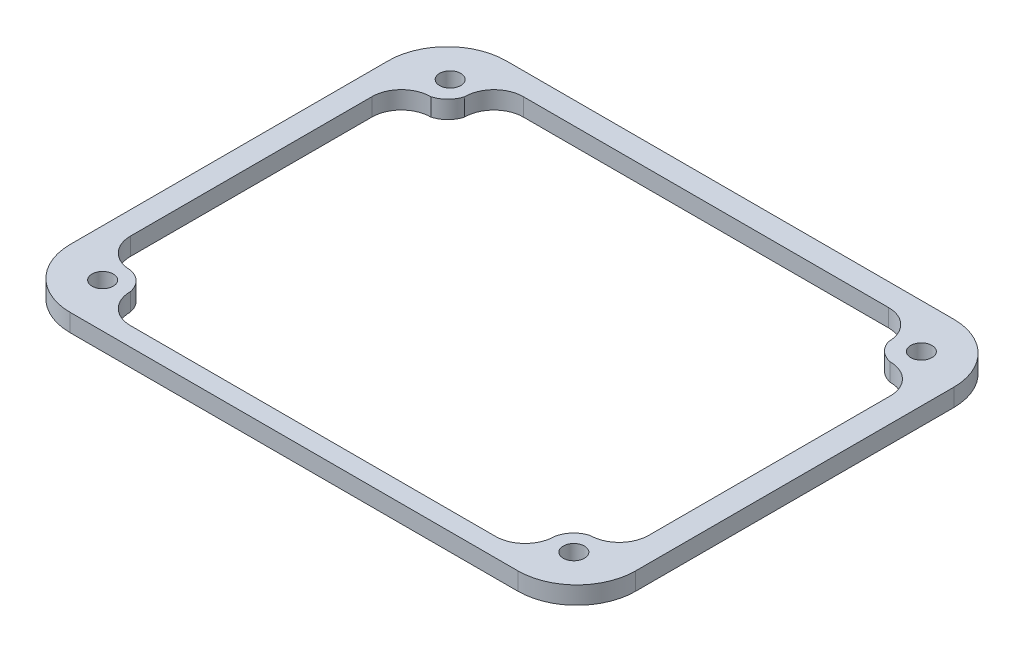
ISO-10303-21;
HEADER;
FILE_DESCRIPTION(('STEP AP214'),'2;1');
FILE_NAME('part.step','',(''),(''),'','','');
FILE_SCHEMA(('AUTOMOTIVE_DESIGN { 1 0 10303 214 1 1 1 1 }'));
ENDSEC;
DATA;
#1=APPLICATION_CONTEXT('core data for automotive mechanical design processes');
#2=APPLICATION_PROTOCOL_DEFINITION('international standard','automotive_design',2000,#1);
#3=PRODUCT_CONTEXT('',#1,'mechanical');
#4=PRODUCT('Part','Part','',(#3));
#5=PRODUCT_RELATED_PRODUCT_CATEGORY('part','',(#4));
#6=PRODUCT_DEFINITION_FORMATION('','',#4);
#7=PRODUCT_DEFINITION_CONTEXT('part definition',#1,'design');
#8=PRODUCT_DEFINITION('design','',#6,#7);
#9=PRODUCT_DEFINITION_SHAPE('','',#8);
#10=(LENGTH_UNIT() NAMED_UNIT(*) SI_UNIT(.MILLI.,.METRE.));
#11=(NAMED_UNIT(*) PLANE_ANGLE_UNIT() SI_UNIT($,.RADIAN.));
#12=(NAMED_UNIT(*) SI_UNIT($,.STERADIAN.) SOLID_ANGLE_UNIT());
#13=UNCERTAINTY_MEASURE_WITH_UNIT(LENGTH_MEASURE(1.E-05),#10,'distance_accuracy_value','');
#14=(GEOMETRIC_REPRESENTATION_CONTEXT(3) GLOBAL_UNCERTAINTY_ASSIGNED_CONTEXT((#13)) GLOBAL_UNIT_ASSIGNED_CONTEXT((#10,
#11,#12)) REPRESENTATION_CONTEXT('',''));
#15=CARTESIAN_POINT('',(0.,0.,0.));
#16=DIRECTION('',(0.,0.,1.));
#17=DIRECTION('',(1.,0.,0.));
#18=AXIS2_PLACEMENT_3D('',#15,#16,#17);
#19=CARTESIAN_POINT('',(-37.8874053561113,3.,26.830201081189));
#20=DIRECTION('',(0.,-1.,0.));
#21=DIRECTION('',(0.,0.,-1.));
#22=AXIS2_PLACEMENT_3D('',#19,#20,#21);
#23=PLANE('',#22);
#24=CARTESIAN_POINT('',(40.1125946438893,3.,29.330201081189));
#25=DIRECTION('',(0.,1.,0.));
#26=DIRECTION('',(0.,0.,1.));
#27=AXIS2_PLACEMENT_3D('',#24,#25,#26);
#28=CIRCLE('',#27,1.8);
#29=CARTESIAN_POINT('',(40.1125946438893,3.,31.130201081189));
#30=VERTEX_POINT('',#29);
#31=EDGE_CURVE('E370',#30,#30,#28,.T.);
#32=ORIENTED_EDGE('',*,*,#31,.F.);
#33=EDGE_LOOP('',(#32));
#34=FACE_BOUND('',#33,.T.);
#35=CARTESIAN_POINT('',(-39.8874053561107,3.,29.330201081189));
#36=DIRECTION('',(0.,1.,0.));
#37=DIRECTION('',(0.,0.,1.));
#38=AXIS2_PLACEMENT_3D('',#35,#36,#37);
#39=CIRCLE('',#38,1.8);
#40=CARTESIAN_POINT('',(-39.8874053561107,3.,31.130201081189));
#41=VERTEX_POINT('',#40);
#42=EDGE_CURVE('E378',#41,#41,#39,.T.);
#43=ORIENTED_EDGE('',*,*,#42,.F.);
#44=EDGE_LOOP('',(#43));
#45=FACE_BOUND('',#44,.T.);
#46=CARTESIAN_POINT('',(40.1125946438887,3.,-29.669798918811));
#47=DIRECTION('',(0.,1.,0.));
#48=DIRECTION('',(0.,0.,1.));
#49=AXIS2_PLACEMENT_3D('',#46,#47,#48);
#50=CIRCLE('',#49,1.8);
#51=CARTESIAN_POINT('',(40.1125946438887,3.,-27.869798918811));
#52=VERTEX_POINT('',#51);
#53=EDGE_CURVE('E386',#52,#52,#50,.T.);
#54=ORIENTED_EDGE('',*,*,#53,.F.);
#55=EDGE_LOOP('',(#54));
#56=FACE_BOUND('',#55,.T.);
#57=CARTESIAN_POINT('',(-39.8874053561113,3.,-29.669798918811));
#58=DIRECTION('',(0.,1.,0.));
#59=DIRECTION('',(0.,0.,1.));
#60=AXIS2_PLACEMENT_3D('',#57,#58,#59);
#61=CIRCLE('',#60,1.8);
#62=CARTESIAN_POINT('',(-39.8874053561113,3.,-27.869798918811));
#63=VERTEX_POINT('',#62);
#64=EDGE_CURVE('E394',#63,#63,#61,.T.);
#65=ORIENTED_EDGE('',*,*,#64,.F.);
#66=EDGE_LOOP('',(#65));
#67=FACE_BOUND('',#66,.T.);
#68=CARTESIAN_POINT('',(-37.8874053561113,3.,26.830201081189));
#69=DIRECTION('',(0.,1.,0.));
#70=DIRECTION('',(0.,0.,-1.));
#71=AXIS2_PLACEMENT_3D('',#68,#69,#70);
#72=CIRCLE('',#71,10.);
#73=CARTESIAN_POINT('',(-47.8874053561113,3.,26.830201081189));
#74=VERTEX_POINT('',#73);
#75=CARTESIAN_POINT('',(-37.8874053561112,3.,36.830201081189));
#76=VERTEX_POINT('',#75);
#77=EDGE_CURVE('E402',#74,#76,#72,.T.);
#78=ORIENTED_EDGE('',*,*,#77,.T.);
#79=DIRECTION('',(1.,0.,0.));
#80=VECTOR('',#79,1.);
#81=CARTESIAN_POINT('',(-37.8874053561112,3.,36.830201081189));
#82=LINE('',#81,#80);
#83=CARTESIAN_POINT('',(38.1125946438886,3.,36.830201081189));
#84=VERTEX_POINT('',#83);
#85=EDGE_CURVE('E406',#76,#84,#82,.T.);
#86=ORIENTED_EDGE('',*,*,#85,.T.);
#87=CARTESIAN_POINT('',(38.1125946438887,3.,26.830201081189));
#88=DIRECTION('',(0.,1.,0.));
#89=DIRECTION('',(0.,0.,1.));
#90=AXIS2_PLACEMENT_3D('',#87,#88,#89);
#91=CIRCLE('',#90,10.);
#92=CARTESIAN_POINT('',(48.1125946438887,3.,26.830201081189));
#93=VERTEX_POINT('',#92);
#94=EDGE_CURVE('E410',#84,#93,#91,.T.);
#95=ORIENTED_EDGE('',*,*,#94,.T.);
#96=DIRECTION('',(0.,0.,-1.));
#97=VECTOR('',#96,1.);
#98=CARTESIAN_POINT('',(48.1125946438887,3.,-27.1697989188109));
#99=LINE('',#98,#97);
#100=CARTESIAN_POINT('',(48.1125946438887,3.,-27.1697989188109));
#101=VERTEX_POINT('',#100);
#102=EDGE_CURVE('E413',#93,#101,#99,.T.);
#103=ORIENTED_EDGE('',*,*,#102,.T.);
#104=CARTESIAN_POINT('',(38.1125946438887,3.,-27.169798918811));
#105=DIRECTION('',(0.,1.,0.));
#106=DIRECTION('',(0.,0.,1.));
#107=AXIS2_PLACEMENT_3D('',#104,#105,#106);
#108=CIRCLE('',#107,10.);
#109=CARTESIAN_POINT('',(38.1125946438886,3.,-37.1697989188109));
#110=VERTEX_POINT('',#109);
#111=EDGE_CURVE('E416',#101,#110,#108,.T.);
#112=ORIENTED_EDGE('',*,*,#111,.T.);
#113=DIRECTION('',(-1.,0.,0.));
#114=VECTOR('',#113,1.);
#115=CARTESIAN_POINT('',(-37.8874053561112,3.,-37.1697989188109));
#116=LINE('',#115,#114);
#117=CARTESIAN_POINT('',(-37.8874053561112,3.,-37.1697989188109));
#118=VERTEX_POINT('',#117);
#119=EDGE_CURVE('E419',#110,#118,#116,.T.);
#120=ORIENTED_EDGE('',*,*,#119,.T.);
#121=CARTESIAN_POINT('',(-37.8874053561113,3.,-27.169798918811));
#122=DIRECTION('',(0.,1.,0.));
#123=DIRECTION('',(0.,0.,-1.));
#124=AXIS2_PLACEMENT_3D('',#121,#122,#123);
#125=CIRCLE('',#124,10.);
#126=CARTESIAN_POINT('',(-47.8874053561113,3.,-27.1697989188109));
#127=VERTEX_POINT('',#126);
#128=EDGE_CURVE('E422',#118,#127,#125,.T.);
#129=ORIENTED_EDGE('',*,*,#128,.T.);
#130=DIRECTION('',(0.,0.,1.));
#131=VECTOR('',#130,1.);
#132=CARTESIAN_POINT('',(-47.8874053561113,3.,-27.1697989188109));
#133=LINE('',#132,#131);
#134=EDGE_CURVE('E425',#127,#74,#133,.T.);
#135=ORIENTED_EDGE('',*,*,#134,.T.);
#136=EDGE_LOOP('',(#78,#86,#95,#103,#112,#120,#129,#135));
#137=FACE_BOUND('',#136,.T.);
#138=CARTESIAN_POINT('',(39.,3.,-20.5));
#139=DIRECTION('',(0.,1.,0.));
#140=DIRECTION('',(0.,0.,1.));
#141=AXIS2_PLACEMENT_3D('',#138,#139,#140);
#142=CIRCLE('',#141,5.);
#143=CARTESIAN_POINT('',(44.,3.,-20.5));
#144=VERTEX_POINT('',#143);
#145=CARTESIAN_POINT('',(39.,3.,-25.5));
#146=VERTEX_POINT('',#145);
#147=EDGE_CURVE('E201',#144,#146,#142,.T.);
#148=ORIENTED_EDGE('',*,*,#147,.F.);
#149=DIRECTION('',(0.,0.,-1.));
#150=VECTOR('',#149,1.);
#151=CARTESIAN_POINT('',(44.,3.,-20.5));
#152=LINE('',#151,#150);
#153=CARTESIAN_POINT('',(44.,3.,20.5));
#154=VERTEX_POINT('',#153);
#155=EDGE_CURVE('E266',#154,#144,#152,.T.);
#156=ORIENTED_EDGE('',*,*,#155,.F.);
#157=CARTESIAN_POINT('',(39.,3.,20.5));
#158=DIRECTION('',(0.,1.,0.));
#159=DIRECTION('',(0.,0.,-1.));
#160=AXIS2_PLACEMENT_3D('',#157,#158,#159);
#161=CIRCLE('',#160,4.99999999999999);
#162=CARTESIAN_POINT('',(39.,3.,25.5));
#163=VERTEX_POINT('',#162);
#164=EDGE_CURVE('E263',#163,#154,#161,.T.);
#165=ORIENTED_EDGE('',*,*,#164,.F.);
#166=CARTESIAN_POINT('',(40.1869870295276,3.,29.4193938558768));
#167=DIRECTION('',(0.,-1.,0.));
#168=DIRECTION('',(0.,0.,1.));
#169=AXIS2_PLACEMENT_3D('',#166,#167,#168);
#170=CIRCLE('',#169,4.0951906433952);
#171=CARTESIAN_POINT('',(36.1623742816907,3.,28.6623742816907));
#172=VERTEX_POINT('',#171);
#173=EDGE_CURVE('E260',#172,#163,#170,.T.);
#174=ORIENTED_EDGE('',*,*,#173,.F.);
#175=CARTESIAN_POINT('',(31.1623742816907,3.,28.6623742816908));
#176=DIRECTION('',(0.,1.,0.));
#177=DIRECTION('',(0.,0.,1.));
#178=AXIS2_PLACEMENT_3D('',#175,#176,#177);
#179=CIRCLE('',#178,5.);
#180=CARTESIAN_POINT('',(31.1623742816907,3.,33.6623742816908));
#181=VERTEX_POINT('',#180);
#182=EDGE_CURVE('E257',#181,#172,#179,.T.);
#183=ORIENTED_EDGE('',*,*,#182,.F.);
#184=DIRECTION('',(1.,0.,0.));
#185=VECTOR('',#184,1.);
#186=CARTESIAN_POINT('',(-30.8376257183093,3.,33.6623742816908));
#187=LINE('',#186,#185);
#188=CARTESIAN_POINT('',(-30.8376257183093,3.,33.6623742816908));
#189=VERTEX_POINT('',#188);
#190=EDGE_CURVE('E254',#189,#181,#187,.T.);
#191=ORIENTED_EDGE('',*,*,#190,.F.);
#192=CARTESIAN_POINT('',(-30.8376257183093,3.,28.6623742816908));
#193=DIRECTION('',(0.,1.,0.));
#194=DIRECTION('',(0.,0.,1.));
#195=AXIS2_PLACEMENT_3D('',#192,#193,#194);
#196=CIRCLE('',#195,5.00000000000001);
#197=CARTESIAN_POINT('',(-35.8376257183093,3.,28.6623742816907));
#198=VERTEX_POINT('',#197);
#199=EDGE_CURVE('E251',#198,#189,#196,.T.);
#200=ORIENTED_EDGE('',*,*,#199,.F.);
#201=CARTESIAN_POINT('',(-39.763988167234,3.,29.4263624489248));
#202=DIRECTION('',(0.,-1.,0.));
#203=DIRECTION('',(0.,0.,-1.));
#204=AXIS2_PLACEMENT_3D('',#201,#202,#203);
#205=CIRCLE('',#204,4.00000000000001);
#206=CARTESIAN_POINT('',(-39.,3.,25.5));
#207=VERTEX_POINT('',#206);
#208=EDGE_CURVE('E248',#207,#198,#205,.T.);
#209=ORIENTED_EDGE('',*,*,#208,.F.);
#210=CARTESIAN_POINT('',(-39.,3.,20.5));
#211=DIRECTION('',(0.,1.,0.));
#212=DIRECTION('',(0.,0.,-1.));
#213=AXIS2_PLACEMENT_3D('',#210,#211,#212);
#214=CIRCLE('',#213,5.);
#215=CARTESIAN_POINT('',(-44.,3.,20.5));
#216=VERTEX_POINT('',#215);
#217=EDGE_CURVE('E245',#216,#207,#214,.T.);
#218=ORIENTED_EDGE('',*,*,#217,.F.);
#219=DIRECTION('',(0.,0.,1.));
#220=VECTOR('',#219,1.);
#221=CARTESIAN_POINT('',(-44.,3.,-20.5));
#222=LINE('',#221,#220);
#223=CARTESIAN_POINT('',(-44.,3.,-20.5));
#224=VERTEX_POINT('',#223);
#225=EDGE_CURVE('E242',#224,#216,#222,.T.);
#226=ORIENTED_EDGE('',*,*,#225,.F.);
#227=CARTESIAN_POINT('',(-39.,3.,-20.5));
#228=DIRECTION('',(0.,1.,0.));
#229=DIRECTION('',(0.,0.,-1.));
#230=AXIS2_PLACEMENT_3D('',#227,#228,#229);
#231=CIRCLE('',#230,5.);
#232=CARTESIAN_POINT('',(-39.,3.,-25.5));
#233=VERTEX_POINT('',#232);
#234=EDGE_CURVE('E239',#233,#224,#231,.T.);
#235=ORIENTED_EDGE('',*,*,#234,.F.);
#236=CARTESIAN_POINT('',(-40.0946445937465,3.,-29.4755309099984));
#237=DIRECTION('',(0.,-1.,0.));
#238=DIRECTION('',(0.,0.,1.));
#239=AXIS2_PLACEMENT_3D('',#236,#237,#238);
#240=CIRCLE('',#239,4.12348066601155);
#241=CARTESIAN_POINT('',(-36.133618934694,3.,-28.3295079908129));
#242=VERTEX_POINT('',#241);
#243=EDGE_CURVE('E236',#242,#233,#240,.T.);
#244=ORIENTED_EDGE('',*,*,#243,.F.);
#245=CARTESIAN_POINT('',(-31.1336745527784,3.,-28.3530914119072));
#246=DIRECTION('',(0.,1.,0.));
#247=DIRECTION('',(0.,0.,1.));
#248=AXIS2_PLACEMENT_3D('',#245,#246,#247);
#249=CIRCLE('',#248,5.);
#250=CARTESIAN_POINT('',(-31.1336745527784,3.,-33.3530914119072));
#251=VERTEX_POINT('',#250);
#252=EDGE_CURVE('E233',#251,#242,#249,.T.);
#253=ORIENTED_EDGE('',*,*,#252,.F.);
#254=DIRECTION('',(-1.,0.,0.));
#255=VECTOR('',#254,1.);
#256=CARTESIAN_POINT('',(-31.1336745527784,3.,-33.3530914119072));
#257=LINE('',#256,#255);
#258=CARTESIAN_POINT('',(30.8663254472212,3.,-33.3530914119072));
#259=VERTEX_POINT('',#258);
#260=EDGE_CURVE('E228',#259,#251,#257,.T.);
#261=ORIENTED_EDGE('',*,*,#260,.F.);
#262=CARTESIAN_POINT('',(30.8663254472212,3.,-28.3530914119072));
#263=DIRECTION('',(0.,1.,0.));
#264=DIRECTION('',(0.,0.,1.));
#265=AXIS2_PLACEMENT_3D('',#262,#263,#264);
#266=CIRCLE('',#265,5.);
#267=CARTESIAN_POINT('',(35.8663254472212,3.,-28.3530914119069));
#268=VERTEX_POINT('',#267);
#269=EDGE_CURVE('E224',#268,#259,#266,.T.);
#270=ORIENTED_EDGE('',*,*,#269,.F.);
#271=CARTESIAN_POINT('',(39.7950733897942,3.,-29.5207350542748));
#272=DIRECTION('',(0.,-1.,0.));
#273=DIRECTION('',(0.,0.,1.));
#274=AXIS2_PLACEMENT_3D('',#271,#272,#273);
#275=CIRCLE('',#274,4.09859147413271);
#276=EDGE_CURVE('E210',#146,#268,#275,.T.);
#277=ORIENTED_EDGE('',*,*,#276,.F.);
#278=EDGE_LOOP('',(#148,#156,#165,#174,#183,#191,#200,#209,#218,#226,#235,#244,#253,#261,#270,#277));
#279=FACE_BOUND('',#278,.T.);
#280=ADVANCED_FACE('F39',(#34,#45,#56,#67,#137,#279),#23,.F.);
#281=CARTESIAN_POINT('',(-37.8874053561113,0.,26.830201081189));
#282=DIRECTION('',(0.,-1.,0.));
#283=DIRECTION('',(0.,0.,-1.));
#284=AXIS2_PLACEMENT_3D('',#281,#282,#283);
#285=PLANE('',#284);
#286=CARTESIAN_POINT('',(-39.8874053561107,0.,29.330201081189));
#287=DIRECTION('',(0.,1.,0.));
#288=DIRECTION('',(0.,0.,1.));
#289=AXIS2_PLACEMENT_3D('',#286,#287,#288);
#290=CIRCLE('',#289,1.8);
#291=CARTESIAN_POINT('',(-39.8874053561107,0.,31.130201081189));
#292=VERTEX_POINT('',#291);
#293=EDGE_CURVE('E374',#292,#292,#290,.T.);
#294=ORIENTED_EDGE('',*,*,#293,.T.);
#295=EDGE_LOOP('',(#294));
#296=FACE_BOUND('',#295,.T.);
#297=CARTESIAN_POINT('',(-39.8874053561113,0.,-29.669798918811));
#298=DIRECTION('',(0.,1.,0.));
#299=DIRECTION('',(0.,0.,1.));
#300=AXIS2_PLACEMENT_3D('',#297,#298,#299);
#301=CIRCLE('',#300,1.8);
#302=CARTESIAN_POINT('',(-39.8874053561113,0.,-27.869798918811));
#303=VERTEX_POINT('',#302);
#304=EDGE_CURVE('E390',#303,#303,#301,.T.);
#305=ORIENTED_EDGE('',*,*,#304,.T.);
#306=EDGE_LOOP('',(#305));
#307=FACE_BOUND('',#306,.T.);
#308=CARTESIAN_POINT('',(-37.8874053561113,0.,26.830201081189));
#309=DIRECTION('',(0.,1.,0.));
#310=DIRECTION('',(0.,0.,-1.));
#311=AXIS2_PLACEMENT_3D('',#308,#309,#310);
#312=CIRCLE('',#311,10.);
#313=CARTESIAN_POINT('',(-47.8874053561113,0.,26.830201081189));
#314=VERTEX_POINT('',#313);
#315=CARTESIAN_POINT('',(-37.8874053561112,0.,36.830201081189));
#316=VERTEX_POINT('',#315);
#317=EDGE_CURVE('E398',#314,#316,#312,.T.);
#318=ORIENTED_EDGE('',*,*,#317,.F.);
#319=DIRECTION('',(0.,0.,1.));
#320=VECTOR('',#319,1.);
#321=CARTESIAN_POINT('',(-47.8874053561113,0.,-27.1697989188109));
#322=LINE('',#321,#320);
#323=CARTESIAN_POINT('',(-47.8874053561113,0.,-27.1697989188109));
#324=VERTEX_POINT('',#323);
#325=EDGE_CURVE('E407',#324,#314,#322,.T.);
#326=ORIENTED_EDGE('',*,*,#325,.F.);
#327=CARTESIAN_POINT('',(-37.8874053561113,0.,-27.169798918811));
#328=DIRECTION('',(0.,1.,0.));
#329=DIRECTION('',(0.,0.,-1.));
#330=AXIS2_PLACEMENT_3D('',#327,#328,#329);
#331=CIRCLE('',#330,10.);
#332=CARTESIAN_POINT('',(-37.8874053561112,0.,-37.1697989188109));
#333=VERTEX_POINT('',#332);
#334=EDGE_CURVE('E447',#333,#324,#331,.T.);
#335=ORIENTED_EDGE('',*,*,#334,.F.);
#336=DIRECTION('',(-1.,0.,0.));
#337=VECTOR('',#336,1.);
#338=CARTESIAN_POINT('',(-37.8874053561112,0.,-37.1697989188109));
#339=LINE('',#338,#337);
#340=CARTESIAN_POINT('',(38.1125946438886,0.,-37.1697989188109));
#341=VERTEX_POINT('',#340);
#342=EDGE_CURVE('E444',#341,#333,#339,.T.);
#343=ORIENTED_EDGE('',*,*,#342,.F.);
#344=CARTESIAN_POINT('',(38.1125946438887,0.,-27.169798918811));
#345=DIRECTION('',(0.,1.,0.));
#346=DIRECTION('',(0.,0.,1.));
#347=AXIS2_PLACEMENT_3D('',#344,#345,#346);
#348=CIRCLE('',#347,10.);
#349=CARTESIAN_POINT('',(48.1125946438887,0.,-27.1697989188109));
#350=VERTEX_POINT('',#349);
#351=EDGE_CURVE('E441',#350,#341,#348,.T.);
#352=ORIENTED_EDGE('',*,*,#351,.F.);
#353=DIRECTION('',(0.,0.,-1.));
#354=VECTOR('',#353,1.);
#355=CARTESIAN_POINT('',(48.1125946438887,0.,-27.1697989188109));
#356=LINE('',#355,#354);
#357=CARTESIAN_POINT('',(48.1125946438887,0.,26.830201081189));
#358=VERTEX_POINT('',#357);
#359=EDGE_CURVE('E438',#358,#350,#356,.T.);
#360=ORIENTED_EDGE('',*,*,#359,.F.);
#361=CARTESIAN_POINT('',(38.1125946438887,0.,26.830201081189));
#362=DIRECTION('',(0.,1.,0.));
#363=DIRECTION('',(0.,0.,1.));
#364=AXIS2_PLACEMENT_3D('',#361,#362,#363);
#365=CIRCLE('',#364,10.);
#366=CARTESIAN_POINT('',(38.1125946438886,0.,36.830201081189));
#367=VERTEX_POINT('',#366);
#368=EDGE_CURVE('E435',#367,#358,#365,.T.);
#369=ORIENTED_EDGE('',*,*,#368,.F.);
#370=DIRECTION('',(1.,0.,0.));
#371=VECTOR('',#370,1.);
#372=CARTESIAN_POINT('',(-37.8874053561112,0.,36.830201081189));
#373=LINE('',#372,#371);
#374=EDGE_CURVE('E432',#316,#367,#373,.T.);
#375=ORIENTED_EDGE('',*,*,#374,.F.);
#376=EDGE_LOOP('',(#318,#326,#335,#343,#352,#360,#369,#375));
#377=FACE_BOUND('',#376,.T.);
#378=CARTESIAN_POINT('',(40.1125946438887,0.,-29.669798918811));
#379=DIRECTION('',(0.,1.,0.));
#380=DIRECTION('',(0.,0.,1.));
#381=AXIS2_PLACEMENT_3D('',#378,#379,#380);
#382=CIRCLE('',#381,1.8);
#383=CARTESIAN_POINT('',(40.1125946438887,0.,-27.869798918811));
#384=VERTEX_POINT('',#383);
#385=EDGE_CURVE('E382',#384,#384,#382,.T.);
#386=ORIENTED_EDGE('',*,*,#385,.T.);
#387=EDGE_LOOP('',(#386));
#388=FACE_BOUND('',#387,.T.);
#389=CARTESIAN_POINT('',(40.1125946438893,0.,29.330201081189));
#390=DIRECTION('',(0.,1.,0.));
#391=DIRECTION('',(0.,0.,1.));
#392=AXIS2_PLACEMENT_3D('',#389,#390,#391);
#393=CIRCLE('',#392,1.8);
#394=CARTESIAN_POINT('',(40.1125946438893,0.,31.130201081189));
#395=VERTEX_POINT('',#394);
#396=EDGE_CURVE('E219',#395,#395,#393,.T.);
#397=ORIENTED_EDGE('',*,*,#396,.T.);
#398=EDGE_LOOP('',(#397));
#399=FACE_BOUND('',#398,.T.);
#400=DIRECTION('',(0.,0.,-1.));
#401=VECTOR('',#400,1.);
#402=CARTESIAN_POINT('',(44.,0.,-20.5));
#403=LINE('',#402,#401);
#404=CARTESIAN_POINT('',(44.,0.,20.5));
#405=VERTEX_POINT('',#404);
#406=CARTESIAN_POINT('',(44.,0.,-20.5));
#407=VERTEX_POINT('',#406);
#408=EDGE_CURVE('E211',#405,#407,#403,.T.);
#409=ORIENTED_EDGE('',*,*,#408,.T.);
#410=CARTESIAN_POINT('',(39.,0.,-20.5));
#411=DIRECTION('',(0.,1.,0.));
#412=DIRECTION('',(0.,0.,1.));
#413=AXIS2_PLACEMENT_3D('',#410,#411,#412);
#414=CIRCLE('',#413,5.);
#415=CARTESIAN_POINT('',(39.,0.,-25.5));
#416=VERTEX_POINT('',#415);
#417=EDGE_CURVE('E63',#407,#416,#414,.T.);
#418=ORIENTED_EDGE('',*,*,#417,.T.);
#419=CARTESIAN_POINT('',(39.7950733897942,0.,-29.5207350542748));
#420=DIRECTION('',(0.,-1.,0.));
#421=DIRECTION('',(0.,0.,1.));
#422=AXIS2_PLACEMENT_3D('',#419,#420,#421);
#423=CIRCLE('',#422,4.09859147413271);
#424=CARTESIAN_POINT('',(35.8663254472212,0.,-28.3530914119069));
#425=VERTEX_POINT('',#424);
#426=EDGE_CURVE('E217',#416,#425,#423,.T.);
#427=ORIENTED_EDGE('',*,*,#426,.T.);
#428=CARTESIAN_POINT('',(30.8663254472212,0.,-28.3530914119072));
#429=DIRECTION('',(0.,1.,0.));
#430=DIRECTION('',(0.,0.,1.));
#431=AXIS2_PLACEMENT_3D('',#428,#429,#430);
#432=CIRCLE('',#431,5.);
#433=CARTESIAN_POINT('',(30.8663254472212,0.,-33.3530914119072));
#434=VERTEX_POINT('',#433);
#435=EDGE_CURVE('E273',#425,#434,#432,.T.);
#436=ORIENTED_EDGE('',*,*,#435,.T.);
#437=DIRECTION('',(-1.,0.,0.));
#438=VECTOR('',#437,1.);
#439=CARTESIAN_POINT('',(-31.1336745527784,0.,-33.3530914119072));
#440=LINE('',#439,#438);
#441=CARTESIAN_POINT('',(-31.1336745527784,0.,-33.3530914119072));
#442=VERTEX_POINT('',#441);
#443=EDGE_CURVE('E277',#434,#442,#440,.T.);
#444=ORIENTED_EDGE('',*,*,#443,.T.);
#445=CARTESIAN_POINT('',(-31.1336745527784,0.,-28.3530914119072));
#446=DIRECTION('',(0.,1.,0.));
#447=DIRECTION('',(0.,0.,1.));
#448=AXIS2_PLACEMENT_3D('',#445,#446,#447);
#449=CIRCLE('',#448,5.);
#450=CARTESIAN_POINT('',(-36.133618934694,0.,-28.3295079908129));
#451=VERTEX_POINT('',#450);
#452=EDGE_CURVE('E281',#442,#451,#449,.T.);
#453=ORIENTED_EDGE('',*,*,#452,.T.);
#454=CARTESIAN_POINT('',(-40.0946445937465,0.,-29.4755309099984));
#455=DIRECTION('',(0.,-1.,0.));
#456=DIRECTION('',(0.,0.,1.));
#457=AXIS2_PLACEMENT_3D('',#454,#455,#456);
#458=CIRCLE('',#457,4.12348066601155);
#459=CARTESIAN_POINT('',(-39.,0.,-25.5));
#460=VERTEX_POINT('',#459);
#461=EDGE_CURVE('E285',#451,#460,#458,.T.);
#462=ORIENTED_EDGE('',*,*,#461,.T.);
#463=CARTESIAN_POINT('',(-39.,0.,-20.5));
#464=DIRECTION('',(0.,1.,0.));
#465=DIRECTION('',(0.,0.,-1.));
#466=AXIS2_PLACEMENT_3D('',#463,#464,#465);
#467=CIRCLE('',#466,5.);
#468=CARTESIAN_POINT('',(-44.,0.,-20.5));
#469=VERTEX_POINT('',#468);
#470=EDGE_CURVE('E289',#460,#469,#467,.T.);
#471=ORIENTED_EDGE('',*,*,#470,.T.);
#472=DIRECTION('',(0.,0.,1.));
#473=VECTOR('',#472,1.);
#474=CARTESIAN_POINT('',(-44.,0.,-20.5));
#475=LINE('',#474,#473);
#476=CARTESIAN_POINT('',(-44.,0.,20.5));
#477=VERTEX_POINT('',#476);
#478=EDGE_CURVE('E293',#469,#477,#475,.T.);
#479=ORIENTED_EDGE('',*,*,#478,.T.);
#480=CARTESIAN_POINT('',(-39.,0.,20.5));
#481=DIRECTION('',(0.,1.,0.));
#482=DIRECTION('',(0.,0.,-1.));
#483=AXIS2_PLACEMENT_3D('',#480,#481,#482);
#484=CIRCLE('',#483,5.);
#485=CARTESIAN_POINT('',(-39.,0.,25.5));
#486=VERTEX_POINT('',#485);
#487=EDGE_CURVE('E297',#477,#486,#484,.T.);
#488=ORIENTED_EDGE('',*,*,#487,.T.);
#489=CARTESIAN_POINT('',(-39.763988167234,0.,29.4263624489248));
#490=DIRECTION('',(0.,-1.,0.));
#491=DIRECTION('',(0.,0.,-1.));
#492=AXIS2_PLACEMENT_3D('',#489,#490,#491);
#493=CIRCLE('',#492,4.00000000000001);
#494=CARTESIAN_POINT('',(-35.8376257183093,0.,28.6623742816907));
#495=VERTEX_POINT('',#494);
#496=EDGE_CURVE('E301',#486,#495,#493,.T.);
#497=ORIENTED_EDGE('',*,*,#496,.T.);
#498=CARTESIAN_POINT('',(-30.8376257183093,0.,28.6623742816908));
#499=DIRECTION('',(0.,1.,0.));
#500=DIRECTION('',(0.,0.,1.));
#501=AXIS2_PLACEMENT_3D('',#498,#499,#500);
#502=CIRCLE('',#501,5.00000000000001);
#503=CARTESIAN_POINT('',(-30.8376257183093,0.,33.6623742816908));
#504=VERTEX_POINT('',#503);
#505=EDGE_CURVE('E305',#495,#504,#502,.T.);
#506=ORIENTED_EDGE('',*,*,#505,.T.);
#507=DIRECTION('',(1.,0.,0.));
#508=VECTOR('',#507,1.);
#509=CARTESIAN_POINT('',(-30.8376257183093,0.,33.6623742816908));
#510=LINE('',#509,#508);
#511=CARTESIAN_POINT('',(31.1623742816907,0.,33.6623742816908));
#512=VERTEX_POINT('',#511);
#513=EDGE_CURVE('E309',#504,#512,#510,.T.);
#514=ORIENTED_EDGE('',*,*,#513,.T.);
#515=CARTESIAN_POINT('',(31.1623742816907,0.,28.6623742816908));
#516=DIRECTION('',(0.,1.,0.));
#517=DIRECTION('',(0.,0.,1.));
#518=AXIS2_PLACEMENT_3D('',#515,#516,#517);
#519=CIRCLE('',#518,5.);
#520=CARTESIAN_POINT('',(36.1623742816907,0.,28.6623742816907));
#521=VERTEX_POINT('',#520);
#522=EDGE_CURVE('E313',#512,#521,#519,.T.);
#523=ORIENTED_EDGE('',*,*,#522,.T.);
#524=CARTESIAN_POINT('',(40.1869870295276,0.,29.4193938558768));
#525=DIRECTION('',(0.,-1.,0.));
#526=DIRECTION('',(0.,0.,1.));
#527=AXIS2_PLACEMENT_3D('',#524,#525,#526);
#528=CIRCLE('',#527,4.0951906433952);
#529=CARTESIAN_POINT('',(39.,0.,25.5));
#530=VERTEX_POINT('',#529);
#531=EDGE_CURVE('E317',#521,#530,#528,.T.);
#532=ORIENTED_EDGE('',*,*,#531,.T.);
#533=CARTESIAN_POINT('',(39.,0.,20.5));
#534=DIRECTION('',(0.,1.,0.));
#535=DIRECTION('',(0.,0.,-1.));
#536=AXIS2_PLACEMENT_3D('',#533,#534,#535);
#537=CIRCLE('',#536,4.99999999999999);
#538=EDGE_CURVE('E321',#530,#405,#537,.T.);
#539=ORIENTED_EDGE('',*,*,#538,.T.);
#540=EDGE_LOOP('',(#409,#418,#427,#436,#444,#453,#462,#471,#479,#488,#497,#506,#514,#523,#532,#539));
#541=FACE_BOUND('',#540,.T.);
#542=ADVANCED_FACE('F486',(#296,#307,#377,#388,#399,#541),#285,.T.);
#543=CARTESIAN_POINT('',(-37.8874053561113,3.,26.830201081189));
#544=DIRECTION('',(0.,-1.,0.));
#545=DIRECTION('',(0.,0.,-1.));
#546=AXIS2_PLACEMENT_3D('',#543,#544,#545);
#547=CYLINDRICAL_SURFACE('',#546,10.);
#548=ORIENTED_EDGE('',*,*,#317,.T.);
#549=DIRECTION('',(0.,-1.,0.));
#550=VECTOR('',#549,1.);
#551=CARTESIAN_POINT('',(-37.8874053561112,3.,36.830201081189));
#552=LINE('',#551,#550);
#553=EDGE_CURVE('E11',#76,#316,#552,.T.);
#554=ORIENTED_EDGE('',*,*,#553,.F.);
#555=ORIENTED_EDGE('',*,*,#77,.F.);
#556=DIRECTION('',(0.,-1.,0.));
#557=VECTOR('',#556,1.);
#558=CARTESIAN_POINT('',(-47.8874053561113,3.,26.830201081189));
#559=LINE('',#558,#557);
#560=EDGE_CURVE('E428',#74,#314,#559,.T.);
#561=ORIENTED_EDGE('',*,*,#560,.T.);
#562=EDGE_LOOP('',(#548,#554,#555,#561));
#563=FACE_BOUND('',#562,.T.);
#564=ADVANCED_FACE('F41',(#563),#547,.T.);
#565=CARTESIAN_POINT('',(-37.8874053561112,3.,36.830201081189));
#566=DIRECTION('',(0.,0.,-1.));
#567=DIRECTION('',(-1.,0.,0.));
#568=AXIS2_PLACEMENT_3D('',#565,#566,#567);
#569=PLANE('',#568);
#570=ORIENTED_EDGE('',*,*,#374,.T.);
#571=DIRECTION('',(0.,-1.,0.));
#572=VECTOR('',#571,1.);
#573=CARTESIAN_POINT('',(38.1125946438886,3.,36.830201081189));
#574=LINE('',#573,#572);
#575=EDGE_CURVE('E48',#84,#367,#574,.T.);
#576=ORIENTED_EDGE('',*,*,#575,.F.);
#577=ORIENTED_EDGE('',*,*,#85,.F.);
#578=ORIENTED_EDGE('',*,*,#553,.T.);
#579=EDGE_LOOP('',(#570,#576,#577,#578));
#580=FACE_BOUND('',#579,.T.);
#581=ADVANCED_FACE('F503',(#580),#569,.F.);
#582=CARTESIAN_POINT('',(38.1125946438887,3.,26.830201081189));
#583=DIRECTION('',(0.,-1.,0.));
#584=DIRECTION('',(0.,0.,-1.));
#585=AXIS2_PLACEMENT_3D('',#582,#583,#584);
#586=CYLINDRICAL_SURFACE('',#585,10.);
#587=ORIENTED_EDGE('',*,*,#368,.T.);
#588=DIRECTION('',(0.,-1.,0.));
#589=VECTOR('',#588,1.);
#590=CARTESIAN_POINT('',(48.1125946438887,3.,26.830201081189));
#591=LINE('',#590,#589);
#592=EDGE_CURVE('E471',#93,#358,#591,.T.);
#593=ORIENTED_EDGE('',*,*,#592,.F.);
#594=ORIENTED_EDGE('',*,*,#94,.F.);
#595=ORIENTED_EDGE('',*,*,#575,.T.);
#596=EDGE_LOOP('',(#587,#593,#594,#595));
#597=FACE_BOUND('',#596,.T.);
#598=ADVANCED_FACE('F480',(#597),#586,.T.);
#599=CARTESIAN_POINT('',(48.1125946438887,3.,-27.1697989188109));
#600=DIRECTION('',(-1.,0.,0.));
#601=DIRECTION('',(0.,0.,1.));
#602=AXIS2_PLACEMENT_3D('',#599,#600,#601);
#603=PLANE('',#602);
#604=ORIENTED_EDGE('',*,*,#359,.T.);
#605=DIRECTION('',(0.,-1.,0.));
#606=VECTOR('',#605,1.);
#607=CARTESIAN_POINT('',(48.1125946438887,3.,-27.1697989188109));
#608=LINE('',#607,#606);
#609=EDGE_CURVE('E467',#101,#350,#608,.T.);
#610=ORIENTED_EDGE('',*,*,#609,.F.);
#611=ORIENTED_EDGE('',*,*,#102,.F.);
#612=ORIENTED_EDGE('',*,*,#592,.T.);
#613=EDGE_LOOP('',(#604,#610,#611,#612));
#614=FACE_BOUND('',#613,.T.);
#615=ADVANCED_FACE('F492',(#614),#603,.F.);
#616=CARTESIAN_POINT('',(38.1125946438887,3.,-27.169798918811));
#617=DIRECTION('',(0.,-1.,0.));
#618=DIRECTION('',(0.,0.,-1.));
#619=AXIS2_PLACEMENT_3D('',#616,#617,#618);
#620=CYLINDRICAL_SURFACE('',#619,10.);
#621=ORIENTED_EDGE('',*,*,#351,.T.);
#622=DIRECTION('',(0.,-1.,0.));
#623=VECTOR('',#622,1.);
#624=CARTESIAN_POINT('',(38.1125946438886,3.,-37.1697989188109));
#625=LINE('',#624,#623);
#626=EDGE_CURVE('E463',#110,#341,#625,.T.);
#627=ORIENTED_EDGE('',*,*,#626,.F.);
#628=ORIENTED_EDGE('',*,*,#111,.F.);
#629=ORIENTED_EDGE('',*,*,#609,.T.);
#630=EDGE_LOOP('',(#621,#627,#628,#629));
#631=FACE_BOUND('',#630,.T.);
#632=ADVANCED_FACE('F496',(#631),#620,.T.);
#633=CARTESIAN_POINT('',(-37.8874053561112,3.,-37.1697989188109));
#634=DIRECTION('',(0.,0.,1.));
#635=DIRECTION('',(1.,0.,0.));
#636=AXIS2_PLACEMENT_3D('',#633,#634,#635);
#637=PLANE('',#636);
#638=ORIENTED_EDGE('',*,*,#342,.T.);
#639=DIRECTION('',(0.,-1.,0.));
#640=VECTOR('',#639,1.);
#641=CARTESIAN_POINT('',(-37.8874053561112,3.,-37.1697989188109));
#642=LINE('',#641,#640);
#643=EDGE_CURVE('E459',#118,#333,#642,.T.);
#644=ORIENTED_EDGE('',*,*,#643,.F.);
#645=ORIENTED_EDGE('',*,*,#119,.F.);
#646=ORIENTED_EDGE('',*,*,#626,.T.);
#647=EDGE_LOOP('',(#638,#644,#645,#646));
#648=FACE_BOUND('',#647,.T.);
#649=ADVANCED_FACE('F516',(#648),#637,.F.);
#650=CARTESIAN_POINT('',(-37.8874053561113,3.,-27.169798918811));
#651=DIRECTION('',(0.,-1.,0.));
#652=DIRECTION('',(0.,0.,-1.));
#653=AXIS2_PLACEMENT_3D('',#650,#651,#652);
#654=CYLINDRICAL_SURFACE('',#653,10.);
#655=ORIENTED_EDGE('',*,*,#334,.T.);
#656=DIRECTION('',(0.,-1.,0.));
#657=VECTOR('',#656,1.);
#658=CARTESIAN_POINT('',(-47.8874053561113,3.,-27.1697989188109));
#659=LINE('',#658,#657);
#660=EDGE_CURVE('E455',#127,#324,#659,.T.);
#661=ORIENTED_EDGE('',*,*,#660,.F.);
#662=ORIENTED_EDGE('',*,*,#128,.F.);
#663=ORIENTED_EDGE('',*,*,#643,.T.);
#664=EDGE_LOOP('',(#655,#661,#662,#663));
#665=FACE_BOUND('',#664,.T.);
#666=ADVANCED_FACE('F514',(#665),#654,.T.);
#667=CARTESIAN_POINT('',(-47.8874053561113,3.,-27.1697989188109));
#668=DIRECTION('',(1.,0.,0.));
#669=DIRECTION('',(0.,0.,-1.));
#670=AXIS2_PLACEMENT_3D('',#667,#668,#669);
#671=PLANE('',#670);
#672=ORIENTED_EDGE('',*,*,#325,.T.);
#673=ORIENTED_EDGE('',*,*,#560,.F.);
#674=ORIENTED_EDGE('',*,*,#134,.F.);
#675=ORIENTED_EDGE('',*,*,#660,.T.);
#676=EDGE_LOOP('',(#672,#673,#674,#675));
#677=FACE_BOUND('',#676,.T.);
#678=ADVANCED_FACE('F509',(#677),#671,.F.);
#679=CARTESIAN_POINT('',(-39.8874053561113,3.,-29.669798918811));
#680=DIRECTION('',(0.,-1.,0.));
#681=DIRECTION('',(0.,0.,-1.));
#682=AXIS2_PLACEMENT_3D('',#679,#680,#681);
#683=CYLINDRICAL_SURFACE('',#682,1.8);
#684=ORIENTED_EDGE('',*,*,#64,.T.);
#685=EDGE_LOOP('',(#684));
#686=FACE_BOUND('',#685,.T.);
#687=ORIENTED_EDGE('',*,*,#304,.F.);
#688=EDGE_LOOP('',(#687));
#689=FACE_BOUND('',#688,.T.);
#690=ADVANCED_FACE('F536',(#686,#689),#683,.F.);
#691=CARTESIAN_POINT('',(40.1125946438887,3.,-29.669798918811));
#692=DIRECTION('',(0.,-1.,0.));
#693=DIRECTION('',(0.,0.,-1.));
#694=AXIS2_PLACEMENT_3D('',#691,#692,#693);
#695=CYLINDRICAL_SURFACE('',#694,1.8);
#696=ORIENTED_EDGE('',*,*,#53,.T.);
#697=EDGE_LOOP('',(#696));
#698=FACE_BOUND('',#697,.T.);
#699=ORIENTED_EDGE('',*,*,#385,.F.);
#700=EDGE_LOOP('',(#699));
#701=FACE_BOUND('',#700,.T.);
#702=ADVANCED_FACE('F543',(#698,#701),#695,.F.);
#703=CARTESIAN_POINT('',(-39.8874053561107,3.,29.330201081189));
#704=DIRECTION('',(0.,-1.,0.));
#705=DIRECTION('',(0.,0.,-1.));
#706=AXIS2_PLACEMENT_3D('',#703,#704,#705);
#707=CYLINDRICAL_SURFACE('',#706,1.8);
#708=ORIENTED_EDGE('',*,*,#42,.T.);
#709=EDGE_LOOP('',(#708));
#710=FACE_BOUND('',#709,.T.);
#711=ORIENTED_EDGE('',*,*,#293,.F.);
#712=EDGE_LOOP('',(#711));
#713=FACE_BOUND('',#712,.T.);
#714=ADVANCED_FACE('F548',(#710,#713),#707,.F.);
#715=CARTESIAN_POINT('',(40.1125946438893,3.,29.330201081189));
#716=DIRECTION('',(0.,-1.,0.));
#717=DIRECTION('',(0.,0.,-1.));
#718=AXIS2_PLACEMENT_3D('',#715,#716,#717);
#719=CYLINDRICAL_SURFACE('',#718,1.8);
#720=ORIENTED_EDGE('',*,*,#31,.T.);
#721=EDGE_LOOP('',(#720));
#722=FACE_BOUND('',#721,.T.);
#723=ORIENTED_EDGE('',*,*,#396,.F.);
#724=EDGE_LOOP('',(#723));
#725=FACE_BOUND('',#724,.T.);
#726=ADVANCED_FACE('F558',(#722,#725),#719,.F.);
#727=CARTESIAN_POINT('',(39.,3.,-20.5));
#728=DIRECTION('',(0.,-1.,0.));
#729=DIRECTION('',(0.,0.,-1.));
#730=AXIS2_PLACEMENT_3D('',#727,#728,#729);
#731=CYLINDRICAL_SURFACE('',#730,5.);
#732=ORIENTED_EDGE('',*,*,#417,.F.);
#733=DIRECTION('',(0.,-1.,0.));
#734=VECTOR('',#733,1.);
#735=CARTESIAN_POINT('',(44.,3.,-20.5));
#736=LINE('',#735,#734);
#737=EDGE_CURVE('E205',#144,#407,#736,.T.);
#738=ORIENTED_EDGE('',*,*,#737,.F.);
#739=ORIENTED_EDGE('',*,*,#147,.T.);
#740=DIRECTION('',(0.,-1.,0.));
#741=VECTOR('',#740,1.);
#742=CARTESIAN_POINT('',(39.,3.,-25.5));
#743=LINE('',#742,#741);
#744=EDGE_CURVE('E204',#146,#416,#743,.T.);
#745=ORIENTED_EDGE('',*,*,#744,.T.);
#746=EDGE_LOOP('',(#732,#738,#739,#745));
#747=FACE_BOUND('',#746,.T.);
#748=ADVANCED_FACE('F203',(#747),#731,.F.);
#749=CARTESIAN_POINT('',(39.7950733897942,3.,-29.5207350542748));
#750=DIRECTION('',(0.,-1.,0.));
#751=DIRECTION('',(0.,0.,-1.));
#752=AXIS2_PLACEMENT_3D('',#749,#750,#751);
#753=CYLINDRICAL_SURFACE('',#752,4.09859147413271);
#754=ORIENTED_EDGE('',*,*,#426,.F.);
#755=ORIENTED_EDGE('',*,*,#744,.F.);
#756=ORIENTED_EDGE('',*,*,#276,.T.);
#757=DIRECTION('',(0.,-1.,0.));
#758=VECTOR('',#757,1.);
#759=CARTESIAN_POINT('',(35.8663254472212,3.,-28.3530914119069));
#760=LINE('',#759,#758);
#761=EDGE_CURVE('E220',#268,#425,#760,.T.);
#762=ORIENTED_EDGE('',*,*,#761,.T.);
#763=EDGE_LOOP('',(#754,#755,#756,#762));
#764=FACE_BOUND('',#763,.T.);
#765=ADVANCED_FACE('F214',(#764),#753,.T.);
#766=CARTESIAN_POINT('',(30.8663254472212,3.,-28.3530914119072));
#767=DIRECTION('',(0.,-1.,0.));
#768=DIRECTION('',(0.,0.,-1.));
#769=AXIS2_PLACEMENT_3D('',#766,#767,#768);
#770=CYLINDRICAL_SURFACE('',#769,5.);
#771=ORIENTED_EDGE('',*,*,#435,.F.);
#772=ORIENTED_EDGE('',*,*,#761,.F.);
#773=ORIENTED_EDGE('',*,*,#269,.T.);
#774=DIRECTION('',(0.,-1.,0.));
#775=VECTOR('',#774,1.);
#776=CARTESIAN_POINT('',(30.8663254472212,3.,-33.3530914119072));
#777=LINE('',#776,#775);
#778=EDGE_CURVE('E365',#259,#434,#777,.T.);
#779=ORIENTED_EDGE('',*,*,#778,.T.);
#780=EDGE_LOOP('',(#771,#772,#773,#779));
#781=FACE_BOUND('',#780,.T.);
#782=ADVANCED_FACE('F570',(#781),#770,.F.);
#783=CARTESIAN_POINT('',(-31.1336745527784,3.,-33.3530914119072));
#784=DIRECTION('',(0.,0.,1.));
#785=DIRECTION('',(1.,0.,0.));
#786=AXIS2_PLACEMENT_3D('',#783,#784,#785);
#787=PLANE('',#786);
#788=ORIENTED_EDGE('',*,*,#443,.F.);
#789=ORIENTED_EDGE('',*,*,#778,.F.);
#790=ORIENTED_EDGE('',*,*,#260,.T.);
#791=DIRECTION('',(0.,-1.,0.));
#792=VECTOR('',#791,1.);
#793=CARTESIAN_POINT('',(-31.1336745527784,3.,-33.3530914119072));
#794=LINE('',#793,#792);
#795=EDGE_CURVE('E362',#251,#442,#794,.T.);
#796=ORIENTED_EDGE('',*,*,#795,.T.);
#797=EDGE_LOOP('',(#788,#789,#790,#796));
#798=FACE_BOUND('',#797,.T.);
#799=ADVANCED_FACE('F573',(#798),#787,.T.);
#800=CARTESIAN_POINT('',(-31.1336745527784,3.,-28.3530914119072));
#801=DIRECTION('',(0.,-1.,0.));
#802=DIRECTION('',(0.,0.,-1.));
#803=AXIS2_PLACEMENT_3D('',#800,#801,#802);
#804=CYLINDRICAL_SURFACE('',#803,5.);
#805=ORIENTED_EDGE('',*,*,#452,.F.);
#806=ORIENTED_EDGE('',*,*,#795,.F.);
#807=ORIENTED_EDGE('',*,*,#252,.T.);
#808=DIRECTION('',(0.,-1.,0.));
#809=VECTOR('',#808,1.);
#810=CARTESIAN_POINT('',(-36.133618934694,3.,-28.3295079908129));
#811=LINE('',#810,#809);
#812=EDGE_CURVE('E359',#242,#451,#811,.T.);
#813=ORIENTED_EDGE('',*,*,#812,.T.);
#814=EDGE_LOOP('',(#805,#806,#807,#813));
#815=FACE_BOUND('',#814,.T.);
#816=ADVANCED_FACE('F577',(#815),#804,.F.);
#817=CARTESIAN_POINT('',(-40.0946445937465,3.,-29.4755309099984));
#818=DIRECTION('',(0.,-1.,0.));
#819=DIRECTION('',(0.,0.,-1.));
#820=AXIS2_PLACEMENT_3D('',#817,#818,#819);
#821=CYLINDRICAL_SURFACE('',#820,4.12348066601155);
#822=ORIENTED_EDGE('',*,*,#461,.F.);
#823=ORIENTED_EDGE('',*,*,#812,.F.);
#824=ORIENTED_EDGE('',*,*,#243,.T.);
#825=DIRECTION('',(0.,-1.,0.));
#826=VECTOR('',#825,1.);
#827=CARTESIAN_POINT('',(-39.,3.,-25.5));
#828=LINE('',#827,#826);
#829=EDGE_CURVE('E356',#233,#460,#828,.T.);
#830=ORIENTED_EDGE('',*,*,#829,.T.);
#831=EDGE_LOOP('',(#822,#823,#824,#830));
#832=FACE_BOUND('',#831,.T.);
#833=ADVANCED_FACE('F581',(#832),#821,.T.);
#834=CARTESIAN_POINT('',(-39.,3.,-20.5));
#835=DIRECTION('',(0.,-1.,0.));
#836=DIRECTION('',(0.,0.,-1.));
#837=AXIS2_PLACEMENT_3D('',#834,#835,#836);
#838=CYLINDRICAL_SURFACE('',#837,5.);
#839=ORIENTED_EDGE('',*,*,#470,.F.);
#840=ORIENTED_EDGE('',*,*,#829,.F.);
#841=ORIENTED_EDGE('',*,*,#234,.T.);
#842=DIRECTION('',(0.,-1.,0.));
#843=VECTOR('',#842,1.);
#844=CARTESIAN_POINT('',(-44.,3.,-20.5));
#845=LINE('',#844,#843);
#846=EDGE_CURVE('E353',#224,#469,#845,.T.);
#847=ORIENTED_EDGE('',*,*,#846,.T.);
#848=EDGE_LOOP('',(#839,#840,#841,#847));
#849=FACE_BOUND('',#848,.T.);
#850=ADVANCED_FACE('F585',(#849),#838,.F.);
#851=CARTESIAN_POINT('',(-44.,3.,-20.5));
#852=DIRECTION('',(1.,0.,0.));
#853=DIRECTION('',(0.,0.,-1.));
#854=AXIS2_PLACEMENT_3D('',#851,#852,#853);
#855=PLANE('',#854);
#856=ORIENTED_EDGE('',*,*,#478,.F.);
#857=ORIENTED_EDGE('',*,*,#846,.F.);
#858=ORIENTED_EDGE('',*,*,#225,.T.);
#859=DIRECTION('',(0.,-1.,0.));
#860=VECTOR('',#859,1.);
#861=CARTESIAN_POINT('',(-44.,3.,20.5));
#862=LINE('',#861,#860);
#863=EDGE_CURVE('E350',#216,#477,#862,.T.);
#864=ORIENTED_EDGE('',*,*,#863,.T.);
#865=EDGE_LOOP('',(#856,#857,#858,#864));
#866=FACE_BOUND('',#865,.T.);
#867=ADVANCED_FACE('F589',(#866),#855,.T.);
#868=CARTESIAN_POINT('',(-39.,3.,20.5));
#869=DIRECTION('',(0.,-1.,0.));
#870=DIRECTION('',(0.,0.,-1.));
#871=AXIS2_PLACEMENT_3D('',#868,#869,#870);
#872=CYLINDRICAL_SURFACE('',#871,5.);
#873=ORIENTED_EDGE('',*,*,#487,.F.);
#874=ORIENTED_EDGE('',*,*,#863,.F.);
#875=ORIENTED_EDGE('',*,*,#217,.T.);
#876=DIRECTION('',(0.,-1.,0.));
#877=VECTOR('',#876,1.);
#878=CARTESIAN_POINT('',(-39.,3.,25.5));
#879=LINE('',#878,#877);
#880=EDGE_CURVE('E347',#207,#486,#879,.T.);
#881=ORIENTED_EDGE('',*,*,#880,.T.);
#882=EDGE_LOOP('',(#873,#874,#875,#881));
#883=FACE_BOUND('',#882,.T.);
#884=ADVANCED_FACE('F593',(#883),#872,.F.);
#885=CARTESIAN_POINT('',(-39.763988167234,3.,29.4263624489248));
#886=DIRECTION('',(0.,-1.,0.));
#887=DIRECTION('',(0.,0.,-1.));
#888=AXIS2_PLACEMENT_3D('',#885,#886,#887);
#889=CYLINDRICAL_SURFACE('',#888,4.00000000000001);
#890=ORIENTED_EDGE('',*,*,#496,.F.);
#891=ORIENTED_EDGE('',*,*,#880,.F.);
#892=ORIENTED_EDGE('',*,*,#208,.T.);
#893=DIRECTION('',(0.,-1.,0.));
#894=VECTOR('',#893,1.);
#895=CARTESIAN_POINT('',(-35.8376257183093,3.,28.6623742816907));
#896=LINE('',#895,#894);
#897=EDGE_CURVE('E344',#198,#495,#896,.T.);
#898=ORIENTED_EDGE('',*,*,#897,.T.);
#899=EDGE_LOOP('',(#890,#891,#892,#898));
#900=FACE_BOUND('',#899,.T.);
#901=ADVANCED_FACE('F597',(#900),#889,.T.);
#902=CARTESIAN_POINT('',(-30.8376257183093,3.,28.6623742816908));
#903=DIRECTION('',(0.,-1.,0.));
#904=DIRECTION('',(0.,0.,-1.));
#905=AXIS2_PLACEMENT_3D('',#902,#903,#904);
#906=CYLINDRICAL_SURFACE('',#905,5.00000000000001);
#907=ORIENTED_EDGE('',*,*,#505,.F.);
#908=ORIENTED_EDGE('',*,*,#897,.F.);
#909=ORIENTED_EDGE('',*,*,#199,.T.);
#910=DIRECTION('',(0.,-1.,0.));
#911=VECTOR('',#910,1.);
#912=CARTESIAN_POINT('',(-30.8376257183093,3.,33.6623742816908));
#913=LINE('',#912,#911);
#914=EDGE_CURVE('E341',#189,#504,#913,.T.);
#915=ORIENTED_EDGE('',*,*,#914,.T.);
#916=EDGE_LOOP('',(#907,#908,#909,#915));
#917=FACE_BOUND('',#916,.T.);
#918=ADVANCED_FACE('F601',(#917),#906,.F.);
#919=CARTESIAN_POINT('',(-30.8376257183093,3.,33.6623742816908));
#920=DIRECTION('',(0.,0.,-1.));
#921=DIRECTION('',(-1.,0.,0.));
#922=AXIS2_PLACEMENT_3D('',#919,#920,#921);
#923=PLANE('',#922);
#924=ORIENTED_EDGE('',*,*,#513,.F.);
#925=ORIENTED_EDGE('',*,*,#914,.F.);
#926=ORIENTED_EDGE('',*,*,#190,.T.);
#927=DIRECTION('',(0.,-1.,0.));
#928=VECTOR('',#927,1.);
#929=CARTESIAN_POINT('',(31.1623742816907,3.,33.6623742816908));
#930=LINE('',#929,#928);
#931=EDGE_CURVE('E338',#181,#512,#930,.T.);
#932=ORIENTED_EDGE('',*,*,#931,.T.);
#933=EDGE_LOOP('',(#924,#925,#926,#932));
#934=FACE_BOUND('',#933,.T.);
#935=ADVANCED_FACE('F605',(#934),#923,.T.);
#936=CARTESIAN_POINT('',(31.1623742816907,3.,28.6623742816908));
#937=DIRECTION('',(0.,-1.,0.));
#938=DIRECTION('',(0.,0.,-1.));
#939=AXIS2_PLACEMENT_3D('',#936,#937,#938);
#940=CYLINDRICAL_SURFACE('',#939,5.);
#941=ORIENTED_EDGE('',*,*,#522,.F.);
#942=ORIENTED_EDGE('',*,*,#931,.F.);
#943=ORIENTED_EDGE('',*,*,#182,.T.);
#944=DIRECTION('',(0.,-1.,0.));
#945=VECTOR('',#944,1.);
#946=CARTESIAN_POINT('',(36.1623742816907,3.,28.6623742816907));
#947=LINE('',#946,#945);
#948=EDGE_CURVE('E335',#172,#521,#947,.T.);
#949=ORIENTED_EDGE('',*,*,#948,.T.);
#950=EDGE_LOOP('',(#941,#942,#943,#949));
#951=FACE_BOUND('',#950,.T.);
#952=ADVANCED_FACE('F609',(#951),#940,.F.);
#953=CARTESIAN_POINT('',(40.1869870295276,3.,29.4193938558768));
#954=DIRECTION('',(0.,-1.,0.));
#955=DIRECTION('',(0.,0.,-1.));
#956=AXIS2_PLACEMENT_3D('',#953,#954,#955);
#957=CYLINDRICAL_SURFACE('',#956,4.0951906433952);
#958=ORIENTED_EDGE('',*,*,#531,.F.);
#959=ORIENTED_EDGE('',*,*,#948,.F.);
#960=ORIENTED_EDGE('',*,*,#173,.T.);
#961=DIRECTION('',(0.,-1.,0.));
#962=VECTOR('',#961,1.);
#963=CARTESIAN_POINT('',(39.,3.,25.5));
#964=LINE('',#963,#962);
#965=EDGE_CURVE('E332',#163,#530,#964,.T.);
#966=ORIENTED_EDGE('',*,*,#965,.T.);
#967=EDGE_LOOP('',(#958,#959,#960,#966));
#968=FACE_BOUND('',#967,.T.);
#969=ADVANCED_FACE('F613',(#968),#957,.T.);
#970=CARTESIAN_POINT('',(39.,3.,20.5));
#971=DIRECTION('',(0.,-1.,0.));
#972=DIRECTION('',(0.,0.,-1.));
#973=AXIS2_PLACEMENT_3D('',#970,#971,#972);
#974=CYLINDRICAL_SURFACE('',#973,4.99999999999999);
#975=ORIENTED_EDGE('',*,*,#538,.F.);
#976=ORIENTED_EDGE('',*,*,#965,.F.);
#977=ORIENTED_EDGE('',*,*,#164,.T.);
#978=DIRECTION('',(0.,-1.,0.));
#979=VECTOR('',#978,1.);
#980=CARTESIAN_POINT('',(44.,3.,20.5));
#981=LINE('',#980,#979);
#982=EDGE_CURVE('E55',#154,#405,#981,.T.);
#983=ORIENTED_EDGE('',*,*,#982,.T.);
#984=EDGE_LOOP('',(#975,#976,#977,#983));
#985=FACE_BOUND('',#984,.T.);
#986=ADVANCED_FACE('F617',(#985),#974,.F.);
#987=CARTESIAN_POINT('',(44.,3.,-20.5));
#988=DIRECTION('',(-1.,0.,0.));
#989=DIRECTION('',(0.,0.,1.));
#990=AXIS2_PLACEMENT_3D('',#987,#988,#989);
#991=PLANE('',#990);
#992=ORIENTED_EDGE('',*,*,#408,.F.);
#993=ORIENTED_EDGE('',*,*,#982,.F.);
#994=ORIENTED_EDGE('',*,*,#155,.T.);
#995=ORIENTED_EDGE('',*,*,#737,.T.);
#996=EDGE_LOOP('',(#992,#993,#994,#995));
#997=FACE_BOUND('',#996,.T.);
#998=ADVANCED_FACE('F621',(#997),#991,.T.);
#999=CLOSED_SHELL('',(#280,#542,#564,#581,#598,#615,#632,#649,#666,#678,#690,#702,#714,#726,
#748,#765,#782,#799,#816,#833,#850,#867,#884,#901,#918,#935,#952,#969,#986,#998));
#1000=MANIFOLD_SOLID_BREP('B2',#999);
#1001=ADVANCED_BREP_SHAPE_REPRESENTATION('',(#18,#1000),#14);
#1002=SHAPE_DEFINITION_REPRESENTATION(#9,#1001);
ENDSEC;
END-ISO-10303-21;
